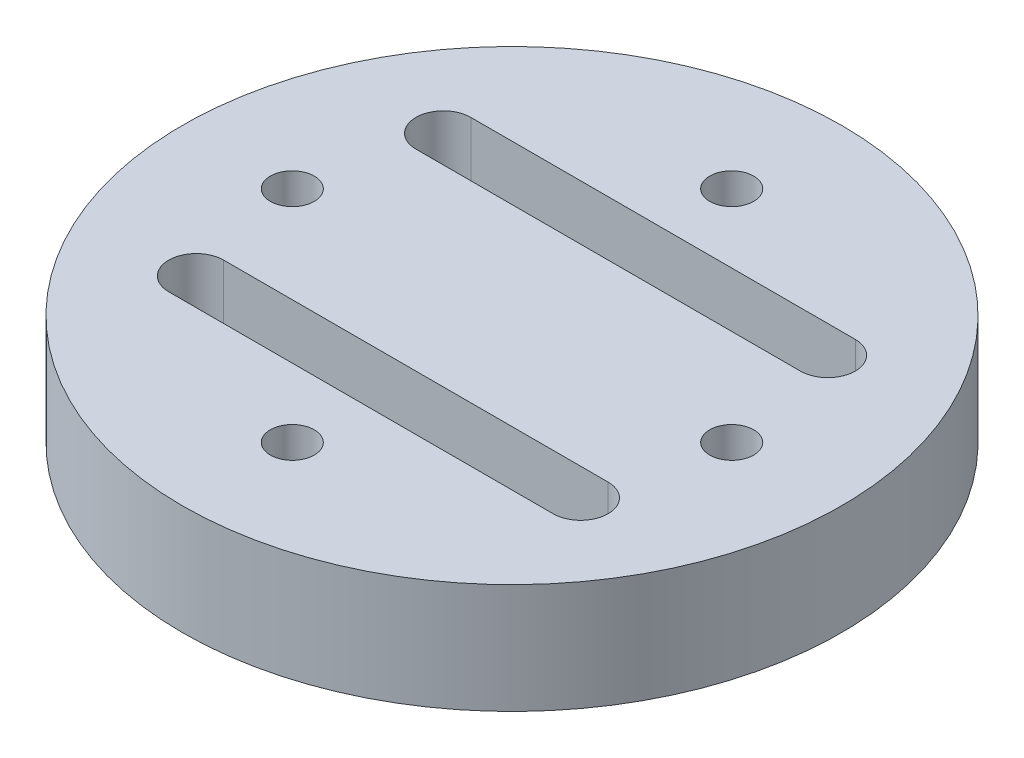
ISO-10303-21;
HEADER;
FILE_DESCRIPTION(('STEP AP214'),'2;1');
FILE_NAME('part.step','',(''),(''),'','','');
FILE_SCHEMA(('AUTOMOTIVE_DESIGN { 1 0 10303 214 1 1 1 1 }'));
ENDSEC;
DATA;
#1=APPLICATION_CONTEXT('core data for automotive mechanical design processes');
#2=APPLICATION_PROTOCOL_DEFINITION('international standard','automotive_design',2000,#1);
#3=PRODUCT_CONTEXT('',#1,'mechanical');
#4=PRODUCT('Part','Part','',(#3));
#5=PRODUCT_RELATED_PRODUCT_CATEGORY('part','',(#4));
#6=PRODUCT_DEFINITION_FORMATION('','',#4);
#7=PRODUCT_DEFINITION_CONTEXT('part definition',#1,'design');
#8=PRODUCT_DEFINITION('design','',#6,#7);
#9=PRODUCT_DEFINITION_SHAPE('','',#8);
#10=(LENGTH_UNIT() NAMED_UNIT(*) SI_UNIT(.MILLI.,.METRE.));
#11=(NAMED_UNIT(*) PLANE_ANGLE_UNIT() SI_UNIT($,.RADIAN.));
#12=(NAMED_UNIT(*) SI_UNIT($,.STERADIAN.) SOLID_ANGLE_UNIT());
#13=UNCERTAINTY_MEASURE_WITH_UNIT(LENGTH_MEASURE(1.E-05),#10,'distance_accuracy_value','');
#14=(GEOMETRIC_REPRESENTATION_CONTEXT(3) GLOBAL_UNCERTAINTY_ASSIGNED_CONTEXT((#13)) GLOBAL_UNIT_ASSIGNED_CONTEXT((#10,
#11,#12)) REPRESENTATION_CONTEXT('',''));
#15=CARTESIAN_POINT('',(0.,0.,0.));
#16=DIRECTION('',(0.,0.,1.));
#17=DIRECTION('',(1.,0.,0.));
#18=AXIS2_PLACEMENT_3D('',#15,#16,#17);
#19=CARTESIAN_POINT('',(0.,0.,0.));
#20=DIRECTION('',(0.,1.,0.));
#21=DIRECTION('',(0.,0.,1.));
#22=AXIS2_PLACEMENT_3D('',#19,#20,#21);
#23=PLANE('',#22);
#24=CARTESIAN_POINT('',(0.,0.,0.));
#25=DIRECTION('',(0.,1.,0.));
#26=DIRECTION('',(0.,0.,1.));
#27=AXIS2_PLACEMENT_3D('',#24,#25,#26);
#28=CIRCLE('',#27,60.);
#29=CARTESIAN_POINT('',(0.,0.,60.));
#30=VERTEX_POINT('',#29);
#31=EDGE_CURVE('E482',#30,#30,#28,.T.);
#32=ORIENTED_EDGE('',*,*,#31,.F.);
#33=EDGE_LOOP('',(#32));
#34=FACE_BOUND('',#33,.T.);
#35=CARTESIAN_POINT('',(-40.,0.,0.));
#36=DIRECTION('',(0.,1.,0.));
#37=DIRECTION('',(0.,0.,1.));
#38=AXIS2_PLACEMENT_3D('',#35,#36,#37);
#39=CIRCLE('',#38,4.00000000000001);
#40=CARTESIAN_POINT('',(-40.,0.,4.));
#41=VERTEX_POINT('',#40);
#42=EDGE_CURVE('E343',#41,#41,#39,.T.);
#43=ORIENTED_EDGE('',*,*,#42,.T.);
#44=EDGE_LOOP('',(#43));
#45=FACE_BOUND('',#44,.T.);
#46=CARTESIAN_POINT('',(0.,0.,40.));
#47=DIRECTION('',(0.,1.,0.));
#48=DIRECTION('',(0.,0.,1.));
#49=AXIS2_PLACEMENT_3D('',#46,#47,#48);
#50=CIRCLE('',#49,4.);
#51=CARTESIAN_POINT('',(0.,0.,44.));
#52=VERTEX_POINT('',#51);
#53=EDGE_CURVE('E365',#52,#52,#50,.T.);
#54=ORIENTED_EDGE('',*,*,#53,.T.);
#55=EDGE_LOOP('',(#54));
#56=FACE_BOUND('',#55,.T.);
#57=CARTESIAN_POINT('',(40.,0.,0.));
#58=DIRECTION('',(0.,1.,0.));
#59=DIRECTION('',(0.,0.,1.));
#60=AXIS2_PLACEMENT_3D('',#57,#58,#59);
#61=CIRCLE('',#60,4.00000000000001);
#62=CARTESIAN_POINT('',(40.,0.,4.));
#63=VERTEX_POINT('',#62);
#64=EDGE_CURVE('E357',#63,#63,#61,.T.);
#65=ORIENTED_EDGE('',*,*,#64,.T.);
#66=EDGE_LOOP('',(#65));
#67=FACE_BOUND('',#66,.T.);
#68=CARTESIAN_POINT('',(0.,0.,-40.));
#69=DIRECTION('',(0.,1.,0.));
#70=DIRECTION('',(0.,0.,1.));
#71=AXIS2_PLACEMENT_3D('',#68,#69,#70);
#72=CIRCLE('',#71,4.);
#73=CARTESIAN_POINT('',(0.,0.,-36.));
#74=VERTEX_POINT('',#73);
#75=EDGE_CURVE('E344',#74,#74,#72,.T.);
#76=ORIENTED_EDGE('',*,*,#75,.T.);
#77=EDGE_LOOP('',(#76));
#78=FACE_BOUND('',#77,.T.);
#79=DIRECTION('',(0.,0.,-1.));
#80=VECTOR('',#79,1.);
#81=CARTESIAN_POINT('',(11.5,0.,27.5));
#82=LINE('',#81,#80);
#83=CARTESIAN_POINT('',(11.5,0.,-27.5));
#84=VERTEX_POINT('',#83);
#85=CARTESIAN_POINT('',(11.5,0.,-29.5));
#86=VERTEX_POINT('',#85);
#87=EDGE_CURVE('E452',#84,#86,#82,.T.);
#88=ORIENTED_EDGE('',*,*,#87,.F.);
#89=DIRECTION('',(-1.,0.,0.));
#90=VECTOR('',#89,1.);
#91=CARTESIAN_POINT('',(-35.,0.,-27.5));
#92=LINE('',#91,#90);
#93=CARTESIAN_POINT('',(-11.5,0.,-27.5));
#94=VERTEX_POINT('',#93);
#95=EDGE_CURVE('E270',#84,#94,#92,.T.);
#96=ORIENTED_EDGE('',*,*,#95,.T.);
#97=DIRECTION('',(0.,0.,-1.));
#98=VECTOR('',#97,1.);
#99=CARTESIAN_POINT('',(-11.5,0.,27.5));
#100=LINE('',#99,#98);
#101=CARTESIAN_POINT('',(-11.5,0.,-29.5));
#102=VERTEX_POINT('',#101);
#103=EDGE_CURVE('E472',#102,#94,#100,.F.);
#104=ORIENTED_EDGE('',*,*,#103,.F.);
#105=DIRECTION('',(1.,0.,0.));
#106=VECTOR('',#105,1.);
#107=CARTESIAN_POINT('',(0.,0.,-29.5));
#108=LINE('',#107,#106);
#109=CARTESIAN_POINT('',(-23.5,0.,-29.5));
#110=VERTEX_POINT('',#109);
#111=EDGE_CURVE('E503',#110,#102,#108,.T.);
#112=ORIENTED_EDGE('',*,*,#111,.F.);
#113=DIRECTION('',(0.,0.,-1.));
#114=VECTOR('',#113,1.);
#115=CARTESIAN_POINT('',(-23.5,0.,27.5));
#116=LINE('',#115,#114);
#117=CARTESIAN_POINT('',(-23.5,0.,-27.5));
#118=VERTEX_POINT('',#117);
#119=EDGE_CURVE('E462',#118,#110,#116,.T.);
#120=ORIENTED_EDGE('',*,*,#119,.F.);
#121=CARTESIAN_POINT('',(-35.,0.,-27.5));
#122=VERTEX_POINT('',#121);
#123=EDGE_CURVE('E253',#118,#122,#92,.T.);
#124=ORIENTED_EDGE('',*,*,#123,.T.);
#125=CARTESIAN_POINT('',(-35.,0.,-22.5));
#126=DIRECTION('',(0.,1.,0.));
#127=DIRECTION('',(0.,0.,1.));
#128=AXIS2_PLACEMENT_3D('',#125,#126,#127);
#129=CIRCLE('',#128,5.);
#130=CARTESIAN_POINT('',(-35.,0.,-17.5));
#131=VERTEX_POINT('',#130);
#132=EDGE_CURVE('E232',#122,#131,#129,.T.);
#133=ORIENTED_EDGE('',*,*,#132,.T.);
#134=DIRECTION('',(1.,0.,0.));
#135=VECTOR('',#134,1.);
#136=CARTESIAN_POINT('',(-35.,0.,-17.5));
#137=LINE('',#136,#135);
#138=CARTESIAN_POINT('',(-23.5,0.,-17.5));
#139=VERTEX_POINT('',#138);
#140=EDGE_CURVE('E241',#131,#139,#137,.T.);
#141=ORIENTED_EDGE('',*,*,#140,.T.);
#142=CARTESIAN_POINT('',(-23.5,0.,-16.25));
#143=VERTEX_POINT('',#142);
#144=EDGE_CURVE('E465',#143,#139,#116,.T.);
#145=ORIENTED_EDGE('',*,*,#144,.F.);
#146=DIRECTION('',(1.,0.,0.));
#147=VECTOR('',#146,1.);
#148=CARTESIAN_POINT('',(0.,0.,-16.25));
#149=LINE('',#148,#147);
#150=CARTESIAN_POINT('',(-33.5,0.,-16.25));
#151=VERTEX_POINT('',#150);
#152=EDGE_CURVE('E394',#151,#143,#149,.T.);
#153=ORIENTED_EDGE('',*,*,#152,.F.);
#154=DIRECTION('',(0.,0.,1.));
#155=VECTOR('',#154,1.);
#156=CARTESIAN_POINT('',(-33.5,0.,-16.25));
#157=LINE('',#156,#155);
#158=CARTESIAN_POINT('',(-33.5,0.,16.25));
#159=VERTEX_POINT('',#158);
#160=EDGE_CURVE('E439',#151,#159,#157,.T.);
#161=ORIENTED_EDGE('',*,*,#160,.T.);
#162=DIRECTION('',(1.,0.,0.));
#163=VECTOR('',#162,1.);
#164=CARTESIAN_POINT('',(0.,0.,16.25));
#165=LINE('',#164,#163);
#166=CARTESIAN_POINT('',(-23.5,0.,16.25));
#167=VERTEX_POINT('',#166);
#168=EDGE_CURVE('E403',#159,#167,#165,.T.);
#169=ORIENTED_EDGE('',*,*,#168,.T.);
#170=CARTESIAN_POINT('',(-23.5,0.,17.5));
#171=VERTEX_POINT('',#170);
#172=EDGE_CURVE('E467',#171,#167,#116,.T.);
#173=ORIENTED_EDGE('',*,*,#172,.F.);
#174=DIRECTION('',(-1.,0.,0.));
#175=VECTOR('',#174,1.);
#176=CARTESIAN_POINT('',(-35.,0.,17.5));
#177=LINE('',#176,#175);
#178=CARTESIAN_POINT('',(-35.,0.,17.5));
#179=VERTEX_POINT('',#178);
#180=EDGE_CURVE('E293',#171,#179,#177,.T.);
#181=ORIENTED_EDGE('',*,*,#180,.T.);
#182=CARTESIAN_POINT('',(-35.,0.,22.5));
#183=DIRECTION('',(0.,1.,0.));
#184=DIRECTION('',(0.,0.,-1.));
#185=AXIS2_PLACEMENT_3D('',#182,#183,#184);
#186=CIRCLE('',#185,5.);
#187=CARTESIAN_POINT('',(-35.,0.,27.5));
#188=VERTEX_POINT('',#187);
#189=EDGE_CURVE('E308',#179,#188,#186,.T.);
#190=ORIENTED_EDGE('',*,*,#189,.T.);
#191=DIRECTION('',(1.,0.,0.));
#192=VECTOR('',#191,1.);
#193=CARTESIAN_POINT('',(0.,0.,27.5));
#194=LINE('',#193,#192);
#195=CARTESIAN_POINT('',(35.,0.,27.5));
#196=VERTEX_POINT('',#195);
#197=EDGE_CURVE('E500',#188,#196,#194,.T.);
#198=ORIENTED_EDGE('',*,*,#197,.T.);
#199=CARTESIAN_POINT('',(35.,0.,22.5));
#200=DIRECTION('',(0.,1.,0.));
#201=DIRECTION('',(0.,0.,-1.));
#202=AXIS2_PLACEMENT_3D('',#199,#200,#201);
#203=CIRCLE('',#202,5.);
#204=CARTESIAN_POINT('',(35.,0.,17.5));
#205=VERTEX_POINT('',#204);
#206=EDGE_CURVE('E322',#196,#205,#203,.T.);
#207=ORIENTED_EDGE('',*,*,#206,.T.);
#208=CARTESIAN_POINT('',(23.5,0.,17.5));
#209=VERTEX_POINT('',#208);
#210=EDGE_CURVE('E318',#205,#209,#177,.T.);
#211=ORIENTED_EDGE('',*,*,#210,.T.);
#212=DIRECTION('',(0.,0.,-1.));
#213=VECTOR('',#212,1.);
#214=CARTESIAN_POINT('',(23.5,0.,27.5));
#215=LINE('',#214,#213);
#216=CARTESIAN_POINT('',(23.5,0.,16.25));
#217=VERTEX_POINT('',#216);
#218=EDGE_CURVE('E456',#217,#209,#215,.F.);
#219=ORIENTED_EDGE('',*,*,#218,.F.);
#220=DIRECTION('',(1.,0.,0.));
#221=VECTOR('',#220,1.);
#222=CARTESIAN_POINT('',(0.,0.,16.25));
#223=LINE('',#222,#221);
#224=CARTESIAN_POINT('',(33.5,0.,16.25));
#225=VERTEX_POINT('',#224);
#226=EDGE_CURVE('E404',#217,#225,#223,.T.);
#227=ORIENTED_EDGE('',*,*,#226,.T.);
#228=DIRECTION('',(0.,0.,1.));
#229=VECTOR('',#228,1.);
#230=CARTESIAN_POINT('',(33.5,0.,-16.25));
#231=LINE('',#230,#229);
#232=CARTESIAN_POINT('',(33.5,0.,-16.25));
#233=VERTEX_POINT('',#232);
#234=EDGE_CURVE('E422',#225,#233,#231,.F.);
#235=ORIENTED_EDGE('',*,*,#234,.T.);
#236=DIRECTION('',(1.,0.,0.));
#237=VECTOR('',#236,1.);
#238=CARTESIAN_POINT('',(0.,0.,-16.25));
#239=LINE('',#238,#237);
#240=CARTESIAN_POINT('',(23.5,0.,-16.25));
#241=VERTEX_POINT('',#240);
#242=EDGE_CURVE('E395',#241,#233,#239,.T.);
#243=ORIENTED_EDGE('',*,*,#242,.F.);
#244=CARTESIAN_POINT('',(23.5,0.,-17.5));
#245=VERTEX_POINT('',#244);
#246=EDGE_CURVE('E460',#245,#241,#215,.F.);
#247=ORIENTED_EDGE('',*,*,#246,.F.);
#248=CARTESIAN_POINT('',(35.,0.,-17.5));
#249=VERTEX_POINT('',#248);
#250=EDGE_CURVE('E250',#245,#249,#137,.T.);
#251=ORIENTED_EDGE('',*,*,#250,.T.);
#252=CARTESIAN_POINT('',(35.,0.,-22.5));
#253=DIRECTION('',(0.,1.,0.));
#254=DIRECTION('',(0.,0.,1.));
#255=AXIS2_PLACEMENT_3D('',#252,#253,#254);
#256=CIRCLE('',#255,5.);
#257=CARTESIAN_POINT('',(35.,0.,-27.5));
#258=VERTEX_POINT('',#257);
#259=EDGE_CURVE('E248',#249,#258,#256,.T.);
#260=ORIENTED_EDGE('',*,*,#259,.T.);
#261=CARTESIAN_POINT('',(23.5,0.,-27.5));
#262=VERTEX_POINT('',#261);
#263=EDGE_CURVE('E238',#258,#262,#92,.T.);
#264=ORIENTED_EDGE('',*,*,#263,.T.);
#265=CARTESIAN_POINT('',(23.5,0.,-29.5));
#266=VERTEX_POINT('',#265);
#267=EDGE_CURVE('E461',#266,#262,#215,.F.);
#268=ORIENTED_EDGE('',*,*,#267,.F.);
#269=DIRECTION('',(1.,0.,0.));
#270=VECTOR('',#269,1.);
#271=CARTESIAN_POINT('',(0.,0.,-29.5));
#272=LINE('',#271,#270);
#273=EDGE_CURVE('E494',#86,#266,#272,.T.);
#274=ORIENTED_EDGE('',*,*,#273,.F.);
#275=EDGE_LOOP('',(#88,#96,#104,#112,#120,#124,#133,#141,#145,#153,#161,#169,#173,#181,#190,
#198,#207,#211,#219,#227,#235,#243,#247,#251,#260,#264,#268,#274));
#276=FACE_BOUND('',#275,.T.);
#277=ADVANCED_FACE('F45',(#34,#45,#56,#67,#78,#276),#23,.F.);
#278=CARTESIAN_POINT('',(11.5,0.,17.5));
#279=VERTEX_POINT('',#278);
#280=CARTESIAN_POINT('',(11.5,0.,16.25));
#281=VERTEX_POINT('',#280);
#282=EDGE_CURVE('E448',#279,#281,#82,.T.);
#283=ORIENTED_EDGE('',*,*,#282,.F.);
#284=CARTESIAN_POINT('',(-11.5,0.,17.5));
#285=VERTEX_POINT('',#284);
#286=EDGE_CURVE('E323',#279,#285,#177,.T.);
#287=ORIENTED_EDGE('',*,*,#286,.T.);
#288=CARTESIAN_POINT('',(-11.5,0.,16.25));
#289=VERTEX_POINT('',#288);
#290=EDGE_CURVE('E466',#289,#285,#100,.F.);
#291=ORIENTED_EDGE('',*,*,#290,.F.);
#292=CARTESIAN_POINT('',(-1.5,0.,16.25));
#293=VERTEX_POINT('',#292);
#294=EDGE_CURVE('E399',#289,#293,#165,.T.);
#295=ORIENTED_EDGE('',*,*,#294,.T.);
#296=DIRECTION('',(0.,0.,1.));
#297=VECTOR('',#296,1.);
#298=CARTESIAN_POINT('',(-1.5,0.,-16.25));
#299=LINE('',#298,#297);
#300=CARTESIAN_POINT('',(-1.5,0.,12.5));
#301=VERTEX_POINT('',#300);
#302=EDGE_CURVE('E438',#293,#301,#299,.F.);
#303=ORIENTED_EDGE('',*,*,#302,.T.);
#304=DIRECTION('',(-1.,0.,0.));
#305=VECTOR('',#304,1.);
#306=CARTESIAN_POINT('',(-30.,0.,12.5));
#307=LINE('',#306,#305);
#308=CARTESIAN_POINT('',(1.5,0.,12.5));
#309=VERTEX_POINT('',#308);
#310=EDGE_CURVE('E483',#309,#301,#307,.T.);
#311=ORIENTED_EDGE('',*,*,#310,.F.);
#312=DIRECTION('',(0.,0.,1.));
#313=VECTOR('',#312,1.);
#314=CARTESIAN_POINT('',(1.5,0.,-16.25));
#315=LINE('',#314,#313);
#316=CARTESIAN_POINT('',(1.5,0.,16.25));
#317=VERTEX_POINT('',#316);
#318=EDGE_CURVE('E417',#309,#317,#315,.T.);
#319=ORIENTED_EDGE('',*,*,#318,.T.);
#320=EDGE_CURVE('E408',#317,#281,#223,.T.);
#321=ORIENTED_EDGE('',*,*,#320,.T.);
#322=EDGE_LOOP('',(#283,#287,#291,#295,#303,#311,#319,#321));
#323=FACE_BOUND('',#322,.T.);
#324=ADVANCED_FACE('F582',(#323),#23,.F.);
#325=CARTESIAN_POINT('',(17.5,0.,27.5));
#326=DIRECTION('',(0.,0.,-1.));
#327=DIRECTION('',(-1.,0.,0.));
#328=AXIS2_PLACEMENT_3D('',#325,#326,#327);
#329=CYLINDRICAL_SURFACE('',#328,6.);
#330=CARTESIAN_POINT('',(17.5,0.,-27.5));
#331=DIRECTION('',(0.,0.,-1.));
#332=DIRECTION('',(-1.,0.,0.));
#333=AXIS2_PLACEMENT_3D('',#330,#331,#332);
#334=CIRCLE('',#333,6.);
#335=EDGE_CURVE('E340',#84,#262,#334,.T.);
#336=ORIENTED_EDGE('',*,*,#335,.F.);
#337=ORIENTED_EDGE('',*,*,#87,.T.);
#338=CARTESIAN_POINT('',(17.5,0.,-29.5));
#339=DIRECTION('',(0.,0.,1.));
#340=DIRECTION('',(1.,0.,0.));
#341=AXIS2_PLACEMENT_3D('',#338,#339,#340);
#342=CIRCLE('',#341,6.);
#343=EDGE_CURVE('E443',#266,#86,#342,.T.);
#344=ORIENTED_EDGE('',*,*,#343,.F.);
#345=ORIENTED_EDGE('',*,*,#267,.T.);
#346=EDGE_LOOP('',(#336,#337,#344,#345));
#347=FACE_BOUND('',#346,.T.);
#348=ADVANCED_FACE('F618',(#347),#329,.F.);
#349=CARTESIAN_POINT('',(-17.5,0.,27.5));
#350=DIRECTION('',(0.,0.,-1.));
#351=DIRECTION('',(-1.,0.,0.));
#352=AXIS2_PLACEMENT_3D('',#349,#350,#351);
#353=CYLINDRICAL_SURFACE('',#352,6.);
#354=CARTESIAN_POINT('',(-17.5,0.,-27.5));
#355=DIRECTION('',(0.,0.,-1.));
#356=DIRECTION('',(-1.,0.,0.));
#357=AXIS2_PLACEMENT_3D('',#354,#355,#356);
#358=CIRCLE('',#357,6.);
#359=EDGE_CURVE('E337',#118,#94,#358,.T.);
#360=ORIENTED_EDGE('',*,*,#359,.F.);
#361=ORIENTED_EDGE('',*,*,#119,.T.);
#362=CARTESIAN_POINT('',(-17.5,0.,-29.5));
#363=DIRECTION('',(0.,0.,1.));
#364=DIRECTION('',(1.,0.,0.));
#365=AXIS2_PLACEMENT_3D('',#362,#363,#364);
#366=CIRCLE('',#365,6.);
#367=EDGE_CURVE('E444',#102,#110,#366,.T.);
#368=ORIENTED_EDGE('',*,*,#367,.F.);
#369=ORIENTED_EDGE('',*,*,#103,.T.);
#370=EDGE_LOOP('',(#360,#361,#368,#369));
#371=FACE_BOUND('',#370,.T.);
#372=ADVANCED_FACE('F629',(#371),#353,.F.);
#373=CARTESIAN_POINT('',(-11.5,0.,-17.5));
#374=VERTEX_POINT('',#373);
#375=CARTESIAN_POINT('',(-11.5,0.,-16.25));
#376=VERTEX_POINT('',#375);
#377=EDGE_CURVE('E471',#374,#376,#100,.F.);
#378=ORIENTED_EDGE('',*,*,#377,.F.);
#379=CARTESIAN_POINT('',(11.5,0.,-17.5));
#380=VERTEX_POINT('',#379);
#381=EDGE_CURVE('E61',#374,#380,#137,.T.);
#382=ORIENTED_EDGE('',*,*,#381,.T.);
#383=CARTESIAN_POINT('',(11.5,0.,-16.25));
#384=VERTEX_POINT('',#383);
#385=EDGE_CURVE('E455',#384,#380,#82,.T.);
#386=ORIENTED_EDGE('',*,*,#385,.F.);
#387=CARTESIAN_POINT('',(1.5,0.,-16.25));
#388=VERTEX_POINT('',#387);
#389=EDGE_CURVE('E398',#388,#384,#239,.T.);
#390=ORIENTED_EDGE('',*,*,#389,.F.);
#391=CARTESIAN_POINT('',(1.5,0.,-12.5));
#392=VERTEX_POINT('',#391);
#393=EDGE_CURVE('E421',#388,#392,#315,.T.);
#394=ORIENTED_EDGE('',*,*,#393,.T.);
#395=DIRECTION('',(1.,0.,0.));
#396=VECTOR('',#395,1.);
#397=CARTESIAN_POINT('',(-30.,0.,-12.5));
#398=LINE('',#397,#396);
#399=CARTESIAN_POINT('',(-1.5,0.,-12.5));
#400=VERTEX_POINT('',#399);
#401=EDGE_CURVE('E478',#400,#392,#398,.T.);
#402=ORIENTED_EDGE('',*,*,#401,.F.);
#403=CARTESIAN_POINT('',(-1.5,0.,-16.25));
#404=VERTEX_POINT('',#403);
#405=EDGE_CURVE('E434',#400,#404,#299,.F.);
#406=ORIENTED_EDGE('',*,*,#405,.T.);
#407=EDGE_CURVE('E380',#376,#404,#149,.T.);
#408=ORIENTED_EDGE('',*,*,#407,.F.);
#409=EDGE_LOOP('',(#378,#382,#386,#390,#394,#402,#406,#408));
#410=FACE_BOUND('',#409,.T.);
#411=ADVANCED_FACE('F546',(#410),#23,.F.);
#412=CARTESIAN_POINT('',(17.5,0.,-17.5));
#413=DIRECTION('',(0.,0.,1.));
#414=DIRECTION('',(1.,0.,0.));
#415=AXIS2_PLACEMENT_3D('',#412,#413,#414);
#416=CIRCLE('',#415,6.);
#417=EDGE_CURVE('E334',#245,#380,#416,.T.);
#418=ORIENTED_EDGE('',*,*,#417,.F.);
#419=ORIENTED_EDGE('',*,*,#246,.T.);
#420=CARTESIAN_POINT('',(17.5,0.,-16.25));
#421=DIRECTION('',(0.,0.,1.));
#422=DIRECTION('',(1.,0.,0.));
#423=AXIS2_PLACEMENT_3D('',#420,#421,#422);
#424=CIRCLE('',#423,6.);
#425=EDGE_CURVE('E510',#241,#384,#424,.T.);
#426=ORIENTED_EDGE('',*,*,#425,.T.);
#427=ORIENTED_EDGE('',*,*,#385,.T.);
#428=EDGE_LOOP('',(#418,#419,#426,#427));
#429=FACE_BOUND('',#428,.T.);
#430=ADVANCED_FACE('F565',(#429),#329,.F.);
#431=CARTESIAN_POINT('',(-17.5,0.,-17.5));
#432=DIRECTION('',(0.,0.,1.));
#433=DIRECTION('',(1.,0.,0.));
#434=AXIS2_PLACEMENT_3D('',#431,#432,#433);
#435=CIRCLE('',#434,6.);
#436=EDGE_CURVE('E243',#374,#139,#435,.T.);
#437=ORIENTED_EDGE('',*,*,#436,.F.);
#438=ORIENTED_EDGE('',*,*,#377,.T.);
#439=CARTESIAN_POINT('',(-17.5,0.,-16.25));
#440=DIRECTION('',(0.,0.,1.));
#441=DIRECTION('',(1.,0.,0.));
#442=AXIS2_PLACEMENT_3D('',#439,#440,#441);
#443=CIRCLE('',#442,6.);
#444=EDGE_CURVE('E506',#376,#143,#443,.T.);
#445=ORIENTED_EDGE('',*,*,#444,.T.);
#446=ORIENTED_EDGE('',*,*,#144,.T.);
#447=EDGE_LOOP('',(#437,#438,#445,#446));
#448=FACE_BOUND('',#447,.T.);
#449=ADVANCED_FACE('F606',(#448),#353,.F.);
#450=CARTESIAN_POINT('',(0.,20.,0.));
#451=DIRECTION('',(0.,-1.,0.));
#452=DIRECTION('',(0.,0.,-1.));
#453=AXIS2_PLACEMENT_3D('',#450,#451,#452);
#454=CYLINDRICAL_SURFACE('',#453,60.);
#455=CARTESIAN_POINT('',(0.,20.,0.));
#456=DIRECTION('',(0.,1.,0.));
#457=DIRECTION('',(0.,0.,1.));
#458=AXIS2_PLACEMENT_3D('',#455,#456,#457);
#459=CIRCLE('',#458,60.);
#460=CARTESIAN_POINT('',(0.,20.,60.));
#461=VERTEX_POINT('',#460);
#462=EDGE_CURVE('E490',#461,#461,#459,.T.);
#463=ORIENTED_EDGE('',*,*,#462,.F.);
#464=EDGE_LOOP('',(#463));
#465=FACE_BOUND('',#464,.T.);
#466=ORIENTED_EDGE('',*,*,#31,.T.);
#467=EDGE_LOOP('',(#466));
#468=FACE_BOUND('',#467,.T.);
#469=ADVANCED_FACE('F47',(#465,#468),#454,.T.);
#470=CARTESIAN_POINT('',(0.,20.,0.));
#471=DIRECTION('',(0.,1.,0.));
#472=DIRECTION('',(0.,0.,1.));
#473=AXIS2_PLACEMENT_3D('',#470,#471,#472);
#474=PLANE('',#473);
#475=CARTESIAN_POINT('',(-35.,20.,-22.5));
#476=DIRECTION('',(0.,1.,0.));
#477=DIRECTION('',(0.,0.,1.));
#478=AXIS2_PLACEMENT_3D('',#475,#476,#477);
#479=CIRCLE('',#478,5.);
#480=CARTESIAN_POINT('',(-35.,20.,-27.5));
#481=VERTEX_POINT('',#480);
#482=CARTESIAN_POINT('',(-35.,20.,-17.5));
#483=VERTEX_POINT('',#482);
#484=EDGE_CURVE('E69',#481,#483,#479,.T.);
#485=ORIENTED_EDGE('',*,*,#484,.F.);
#486=DIRECTION('',(-1.,0.,0.));
#487=VECTOR('',#486,1.);
#488=CARTESIAN_POINT('',(-35.,20.,-27.5));
#489=LINE('',#488,#487);
#490=CARTESIAN_POINT('',(35.,20.,-27.5));
#491=VERTEX_POINT('',#490);
#492=EDGE_CURVE('E255',#491,#481,#489,.T.);
#493=ORIENTED_EDGE('',*,*,#492,.F.);
#494=CARTESIAN_POINT('',(35.,20.,-22.5));
#495=DIRECTION('',(0.,1.,0.));
#496=DIRECTION('',(0.,0.,1.));
#497=AXIS2_PLACEMENT_3D('',#494,#495,#496);
#498=CIRCLE('',#497,5.);
#499=CARTESIAN_POINT('',(35.,20.,-17.5));
#500=VERTEX_POINT('',#499);
#501=EDGE_CURVE('E261',#500,#491,#498,.T.);
#502=ORIENTED_EDGE('',*,*,#501,.F.);
#503=DIRECTION('',(1.,0.,0.));
#504=VECTOR('',#503,1.);
#505=CARTESIAN_POINT('',(-35.,20.,-17.5));
#506=LINE('',#505,#504);
#507=EDGE_CURVE('E273',#483,#500,#506,.T.);
#508=ORIENTED_EDGE('',*,*,#507,.F.);
#509=EDGE_LOOP('',(#485,#493,#502,#508));
#510=FACE_BOUND('',#509,.T.);
#511=CARTESIAN_POINT('',(-35.,20.,22.5));
#512=DIRECTION('',(0.,1.,0.));
#513=DIRECTION('',(0.,0.,-1.));
#514=AXIS2_PLACEMENT_3D('',#511,#512,#513);
#515=CIRCLE('',#514,5.);
#516=CARTESIAN_POINT('',(-35.,20.,17.5));
#517=VERTEX_POINT('',#516);
#518=CARTESIAN_POINT('',(-35.,20.,27.5));
#519=VERTEX_POINT('',#518);
#520=EDGE_CURVE('E274',#517,#519,#515,.T.);
#521=ORIENTED_EDGE('',*,*,#520,.F.);
#522=DIRECTION('',(-1.,0.,0.));
#523=VECTOR('',#522,1.);
#524=CARTESIAN_POINT('',(-35.,20.,17.5));
#525=LINE('',#524,#523);
#526=CARTESIAN_POINT('',(35.,20.,17.5));
#527=VERTEX_POINT('',#526);
#528=EDGE_CURVE('E303',#527,#517,#525,.T.);
#529=ORIENTED_EDGE('',*,*,#528,.F.);
#530=CARTESIAN_POINT('',(35.,20.,22.5));
#531=DIRECTION('',(0.,1.,0.));
#532=DIRECTION('',(0.,0.,-1.));
#533=AXIS2_PLACEMENT_3D('',#530,#531,#532);
#534=CIRCLE('',#533,5.);
#535=CARTESIAN_POINT('',(35.,20.,27.5));
#536=VERTEX_POINT('',#535);
#537=EDGE_CURVE('E307',#536,#527,#534,.T.);
#538=ORIENTED_EDGE('',*,*,#537,.F.);
#539=DIRECTION('',(1.,0.,0.));
#540=VECTOR('',#539,1.);
#541=CARTESIAN_POINT('',(-35.,20.,27.5));
#542=LINE('',#541,#540);
#543=EDGE_CURVE('E312',#519,#536,#542,.T.);
#544=ORIENTED_EDGE('',*,*,#543,.F.);
#545=EDGE_LOOP('',(#521,#529,#538,#544));
#546=FACE_BOUND('',#545,.T.);
#547=CARTESIAN_POINT('',(0.,20.,-40.));
#548=DIRECTION('',(0.,1.,0.));
#549=DIRECTION('',(0.,0.,1.));
#550=AXIS2_PLACEMENT_3D('',#547,#548,#549);
#551=CIRCLE('',#550,4.);
#552=CARTESIAN_POINT('',(0.,20.,-36.));
#553=VERTEX_POINT('',#552);
#554=EDGE_CURVE('E349',#553,#553,#551,.T.);
#555=ORIENTED_EDGE('',*,*,#554,.F.);
#556=EDGE_LOOP('',(#555));
#557=FACE_BOUND('',#556,.T.);
#558=CARTESIAN_POINT('',(40.,20.,0.));
#559=DIRECTION('',(0.,1.,0.));
#560=DIRECTION('',(0.,0.,1.));
#561=AXIS2_PLACEMENT_3D('',#558,#559,#560);
#562=CIRCLE('',#561,4.00000000000001);
#563=CARTESIAN_POINT('',(40.,20.,4.));
#564=VERTEX_POINT('',#563);
#565=EDGE_CURVE('E353',#564,#564,#562,.T.);
#566=ORIENTED_EDGE('',*,*,#565,.F.);
#567=EDGE_LOOP('',(#566));
#568=FACE_BOUND('',#567,.T.);
#569=CARTESIAN_POINT('',(0.,20.,40.));
#570=DIRECTION('',(0.,1.,0.));
#571=DIRECTION('',(0.,0.,1.));
#572=AXIS2_PLACEMENT_3D('',#569,#570,#571);
#573=CIRCLE('',#572,4.);
#574=CARTESIAN_POINT('',(0.,20.,44.));
#575=VERTEX_POINT('',#574);
#576=EDGE_CURVE('E361',#575,#575,#573,.T.);
#577=ORIENTED_EDGE('',*,*,#576,.F.);
#578=EDGE_LOOP('',(#577));
#579=FACE_BOUND('',#578,.T.);
#580=CARTESIAN_POINT('',(-40.,20.,0.));
#581=DIRECTION('',(0.,1.,0.));
#582=DIRECTION('',(0.,0.,1.));
#583=AXIS2_PLACEMENT_3D('',#580,#581,#582);
#584=CIRCLE('',#583,4.00000000000001);
#585=CARTESIAN_POINT('',(-40.,20.,4.));
#586=VERTEX_POINT('',#585);
#587=EDGE_CURVE('E369',#586,#586,#584,.T.);
#588=ORIENTED_EDGE('',*,*,#587,.F.);
#589=EDGE_LOOP('',(#588));
#590=FACE_BOUND('',#589,.T.);
#591=ORIENTED_EDGE('',*,*,#462,.T.);
#592=EDGE_LOOP('',(#591));
#593=FACE_BOUND('',#592,.T.);
#594=ADVANCED_FACE('F671',(#510,#546,#557,#568,#579,#590,#593),#474,.T.);
#595=CARTESIAN_POINT('',(-30.,8.,-12.5));
#596=DIRECTION('',(0.,0.,-1.));
#597=DIRECTION('',(-1.,0.,0.));
#598=AXIS2_PLACEMENT_3D('',#595,#596,#597);
#599=PLANE('',#598);
#600=DIRECTION('',(1.,0.,0.));
#601=VECTOR('',#600,1.);
#602=CARTESIAN_POINT('',(-30.,8.,-12.5));
#603=LINE('',#602,#601);
#604=CARTESIAN_POINT('',(-3.64359353944898,8.,-12.5));
#605=VERTEX_POINT('',#604);
#606=CARTESIAN_POINT('',(3.64359353944898,8.,-12.5));
#607=VERTEX_POINT('',#606);
#608=EDGE_CURVE('E477',#605,#607,#603,.T.);
#609=ORIENTED_EDGE('',*,*,#608,.F.);
#610=CARTESIAN_POINT('',(-17.5,0.,-12.5));
#611=DIRECTION('',(0.,0.,-1.));
#612=DIRECTION('',(-1.,0.,0.));
#613=AXIS2_PLACEMENT_3D('',#610,#611,#612);
#614=CIRCLE('',#613,16.);
#615=EDGE_CURVE('E430',#605,#400,#614,.T.);
#616=ORIENTED_EDGE('',*,*,#615,.T.);
#617=ORIENTED_EDGE('',*,*,#401,.T.);
#618=CARTESIAN_POINT('',(17.5,0.,-12.5));
#619=DIRECTION('',(0.,0.,-1.));
#620=DIRECTION('',(-1.,0.,0.));
#621=AXIS2_PLACEMENT_3D('',#618,#619,#620);
#622=CIRCLE('',#621,16.);
#623=EDGE_CURVE('E413',#392,#607,#622,.T.);
#624=ORIENTED_EDGE('',*,*,#623,.T.);
#625=EDGE_LOOP('',(#609,#616,#617,#624));
#626=FACE_BOUND('',#625,.T.);
#627=ADVANCED_FACE('F542',(#626),#599,.F.);
#628=CARTESIAN_POINT('',(-30.,8.,12.5));
#629=DIRECTION('',(0.,0.,1.));
#630=DIRECTION('',(1.,0.,0.));
#631=AXIS2_PLACEMENT_3D('',#628,#629,#630);
#632=PLANE('',#631);
#633=ORIENTED_EDGE('',*,*,#310,.T.);
#634=CARTESIAN_POINT('',(-17.5,0.,12.5));
#635=DIRECTION('',(0.,0.,1.));
#636=DIRECTION('',(1.,0.,0.));
#637=AXIS2_PLACEMENT_3D('',#634,#635,#636);
#638=CIRCLE('',#637,16.);
#639=CARTESIAN_POINT('',(-3.64359353944898,8.,12.5));
#640=VERTEX_POINT('',#639);
#641=EDGE_CURVE('E426',#301,#640,#638,.T.);
#642=ORIENTED_EDGE('',*,*,#641,.T.);
#643=DIRECTION('',(-1.,0.,0.));
#644=VECTOR('',#643,1.);
#645=CARTESIAN_POINT('',(-30.,8.,12.5));
#646=LINE('',#645,#644);
#647=CARTESIAN_POINT('',(3.64359353944898,8.,12.5));
#648=VERTEX_POINT('',#647);
#649=EDGE_CURVE('E473',#648,#640,#646,.T.);
#650=ORIENTED_EDGE('',*,*,#649,.F.);
#651=CARTESIAN_POINT('',(17.5,0.,12.5));
#652=DIRECTION('',(0.,0.,1.));
#653=DIRECTION('',(1.,0.,0.));
#654=AXIS2_PLACEMENT_3D('',#651,#652,#653);
#655=CIRCLE('',#654,16.);
#656=EDGE_CURVE('E409',#648,#309,#655,.T.);
#657=ORIENTED_EDGE('',*,*,#656,.T.);
#658=EDGE_LOOP('',(#633,#642,#650,#657));
#659=FACE_BOUND('',#658,.T.);
#660=ADVANCED_FACE('F534',(#659),#632,.F.);
#661=CARTESIAN_POINT('',(0.,8.,0.));
#662=DIRECTION('',(0.,-1.,0.));
#663=DIRECTION('',(0.,0.,-1.));
#664=AXIS2_PLACEMENT_3D('',#661,#662,#663);
#665=PLANE('',#664);
#666=DIRECTION('',(0.,0.,1.));
#667=VECTOR('',#666,1.);
#668=CARTESIAN_POINT('',(-3.64359353944898,8.,-16.25));
#669=LINE('',#668,#667);
#670=EDGE_CURVE('E54',#605,#640,#669,.T.);
#671=ORIENTED_EDGE('',*,*,#670,.F.);
#672=ORIENTED_EDGE('',*,*,#608,.T.);
#673=DIRECTION('',(0.,0.,1.));
#674=VECTOR('',#673,1.);
#675=CARTESIAN_POINT('',(3.64359353944898,8.,-16.25));
#676=LINE('',#675,#674);
#677=EDGE_CURVE('E522',#648,#607,#676,.F.);
#678=ORIENTED_EDGE('',*,*,#677,.F.);
#679=ORIENTED_EDGE('',*,*,#649,.T.);
#680=EDGE_LOOP('',(#671,#672,#678,#679));
#681=FACE_BOUND('',#680,.T.);
#682=ADVANCED_FACE('F537',(#681),#665,.T.);
#683=CARTESIAN_POINT('',(17.5,0.,17.5));
#684=DIRECTION('',(0.,0.,-1.));
#685=DIRECTION('',(-1.,0.,0.));
#686=AXIS2_PLACEMENT_3D('',#683,#684,#685);
#687=CIRCLE('',#686,6.);
#688=EDGE_CURVE('E283',#279,#209,#687,.T.);
#689=ORIENTED_EDGE('',*,*,#688,.F.);
#690=ORIENTED_EDGE('',*,*,#282,.T.);
#691=CARTESIAN_POINT('',(17.5,0.,16.25));
#692=DIRECTION('',(0.,0.,1.));
#693=DIRECTION('',(1.,0.,0.));
#694=AXIS2_PLACEMENT_3D('',#691,#692,#693);
#695=CIRCLE('',#694,6.);
#696=EDGE_CURVE('E518',#217,#281,#695,.T.);
#697=ORIENTED_EDGE('',*,*,#696,.F.);
#698=ORIENTED_EDGE('',*,*,#218,.T.);
#699=EDGE_LOOP('',(#689,#690,#697,#698));
#700=FACE_BOUND('',#699,.T.);
#701=ADVANCED_FACE('F575',(#700),#329,.F.);
#702=CARTESIAN_POINT('',(-17.5,0.,17.5));
#703=DIRECTION('',(0.,0.,-1.));
#704=DIRECTION('',(-1.,0.,0.));
#705=AXIS2_PLACEMENT_3D('',#702,#703,#704);
#706=CIRCLE('',#705,6.);
#707=EDGE_CURVE('E11',#171,#285,#706,.T.);
#708=ORIENTED_EDGE('',*,*,#707,.F.);
#709=ORIENTED_EDGE('',*,*,#172,.T.);
#710=CARTESIAN_POINT('',(-17.5,0.,16.25));
#711=DIRECTION('',(0.,0.,1.));
#712=DIRECTION('',(1.,0.,0.));
#713=AXIS2_PLACEMENT_3D('',#710,#711,#712);
#714=CIRCLE('',#713,6.);
#715=EDGE_CURVE('E514',#289,#167,#714,.T.);
#716=ORIENTED_EDGE('',*,*,#715,.F.);
#717=ORIENTED_EDGE('',*,*,#290,.T.);
#718=EDGE_LOOP('',(#708,#709,#716,#717));
#719=FACE_BOUND('',#718,.T.);
#720=ADVANCED_FACE('F596',(#719),#353,.F.);
#721=CARTESIAN_POINT('',(-17.5,0.,27.5));
#722=DIRECTION('',(0.,0.,1.));
#723=DIRECTION('',(1.,0.,0.));
#724=AXIS2_PLACEMENT_3D('',#721,#722,#723);
#725=PLANE('',#724);
#726=ORIENTED_EDGE('',*,*,#197,.F.);
#727=DIRECTION('',(0.,1.,0.));
#728=VECTOR('',#727,1.);
#729=CARTESIAN_POINT('',(-35.,0.,27.5));
#730=LINE('',#729,#728);
#731=EDGE_CURVE('E289',#188,#519,#730,.T.);
#732=ORIENTED_EDGE('',*,*,#731,.T.);
#733=ORIENTED_EDGE('',*,*,#543,.T.);
#734=DIRECTION('',(0.,1.,0.));
#735=VECTOR('',#734,1.);
#736=CARTESIAN_POINT('',(35.,0.,27.5));
#737=LINE('',#736,#735);
#738=EDGE_CURVE('E294',#196,#536,#737,.T.);
#739=ORIENTED_EDGE('',*,*,#738,.F.);
#740=EDGE_LOOP('',(#726,#732,#733,#739));
#741=FACE_BOUND('',#740,.T.);
#742=ADVANCED_FACE('F641',(#741),#725,.F.);
#743=CARTESIAN_POINT('',(17.5,0.,-29.5));
#744=DIRECTION('',(0.,0.,1.));
#745=DIRECTION('',(1.,0.,0.));
#746=AXIS2_PLACEMENT_3D('',#743,#744,#745);
#747=PLANE('',#746);
#748=ORIENTED_EDGE('',*,*,#273,.T.);
#749=ORIENTED_EDGE('',*,*,#343,.T.);
#750=EDGE_LOOP('',(#748,#749));
#751=FACE_BOUND('',#750,.T.);
#752=ADVANCED_FACE('F633',(#751),#747,.T.);
#753=CARTESIAN_POINT('',(-17.5,0.,-29.5));
#754=DIRECTION('',(0.,0.,1.));
#755=DIRECTION('',(1.,0.,0.));
#756=AXIS2_PLACEMENT_3D('',#753,#754,#755);
#757=PLANE('',#756);
#758=ORIENTED_EDGE('',*,*,#111,.T.);
#759=ORIENTED_EDGE('',*,*,#367,.T.);
#760=EDGE_LOOP('',(#758,#759));
#761=FACE_BOUND('',#760,.T.);
#762=ADVANCED_FACE('F631',(#761),#757,.T.);
#763=CARTESIAN_POINT('',(-17.5,0.,-16.25));
#764=DIRECTION('',(0.,0.,1.));
#765=DIRECTION('',(1.,0.,0.));
#766=AXIS2_PLACEMENT_3D('',#763,#764,#765);
#767=CYLINDRICAL_SURFACE('',#766,16.);
#768=CARTESIAN_POINT('',(-17.5,0.,-16.25));
#769=DIRECTION('',(0.,0.,1.));
#770=DIRECTION('',(1.,0.,0.));
#771=AXIS2_PLACEMENT_3D('',#768,#769,#770);
#772=CIRCLE('',#771,16.);
#773=EDGE_CURVE('E376',#404,#151,#772,.T.);
#774=ORIENTED_EDGE('',*,*,#773,.F.);
#775=ORIENTED_EDGE('',*,*,#405,.F.);
#776=ORIENTED_EDGE('',*,*,#615,.F.);
#777=ORIENTED_EDGE('',*,*,#670,.T.);
#778=ORIENTED_EDGE('',*,*,#641,.F.);
#779=ORIENTED_EDGE('',*,*,#302,.F.);
#780=CARTESIAN_POINT('',(-17.5,0.,16.25));
#781=DIRECTION('',(0.,0.,1.));
#782=DIRECTION('',(1.,0.,0.));
#783=AXIS2_PLACEMENT_3D('',#780,#781,#782);
#784=CIRCLE('',#783,16.);
#785=EDGE_CURVE('E381',#293,#159,#784,.T.);
#786=ORIENTED_EDGE('',*,*,#785,.T.);
#787=ORIENTED_EDGE('',*,*,#160,.F.);
#788=EDGE_LOOP('',(#774,#775,#776,#777,#778,#779,#786,#787));
#789=FACE_BOUND('',#788,.T.);
#790=ADVANCED_FACE('F528',(#789),#767,.F.);
#791=CARTESIAN_POINT('',(-17.5,0.,16.25));
#792=DIRECTION('',(0.,0.,1.));
#793=DIRECTION('',(1.,0.,0.));
#794=AXIS2_PLACEMENT_3D('',#791,#792,#793);
#795=PLANE('',#794);
#796=ORIENTED_EDGE('',*,*,#785,.F.);
#797=ORIENTED_EDGE('',*,*,#294,.F.);
#798=ORIENTED_EDGE('',*,*,#715,.T.);
#799=ORIENTED_EDGE('',*,*,#168,.F.);
#800=EDGE_LOOP('',(#796,#797,#798,#799));
#801=FACE_BOUND('',#800,.T.);
#802=ADVANCED_FACE('F600',(#801),#795,.F.);
#803=CARTESIAN_POINT('',(-17.5,0.,-16.25));
#804=DIRECTION('',(0.,0.,1.));
#805=DIRECTION('',(1.,0.,0.));
#806=AXIS2_PLACEMENT_3D('',#803,#804,#805);
#807=PLANE('',#806);
#808=ORIENTED_EDGE('',*,*,#152,.T.);
#809=ORIENTED_EDGE('',*,*,#444,.F.);
#810=ORIENTED_EDGE('',*,*,#407,.T.);
#811=ORIENTED_EDGE('',*,*,#773,.T.);
#812=EDGE_LOOP('',(#808,#809,#810,#811));
#813=FACE_BOUND('',#812,.T.);
#814=ADVANCED_FACE('F604',(#813),#807,.T.);
#815=CARTESIAN_POINT('',(17.5,0.,-16.25));
#816=DIRECTION('',(0.,0.,1.));
#817=DIRECTION('',(1.,0.,0.));
#818=AXIS2_PLACEMENT_3D('',#815,#816,#817);
#819=CYLINDRICAL_SURFACE('',#818,16.);
#820=CARTESIAN_POINT('',(17.5,0.,16.25));
#821=DIRECTION('',(0.,0.,1.));
#822=DIRECTION('',(1.,0.,0.));
#823=AXIS2_PLACEMENT_3D('',#820,#821,#822);
#824=CIRCLE('',#823,16.);
#825=EDGE_CURVE('E385',#225,#317,#824,.T.);
#826=ORIENTED_EDGE('',*,*,#825,.T.);
#827=ORIENTED_EDGE('',*,*,#318,.F.);
#828=ORIENTED_EDGE('',*,*,#656,.F.);
#829=ORIENTED_EDGE('',*,*,#677,.T.);
#830=ORIENTED_EDGE('',*,*,#623,.F.);
#831=ORIENTED_EDGE('',*,*,#393,.F.);
#832=CARTESIAN_POINT('',(17.5,0.,-16.25));
#833=DIRECTION('',(0.,0.,1.));
#834=DIRECTION('',(1.,0.,0.));
#835=AXIS2_PLACEMENT_3D('',#832,#833,#834);
#836=CIRCLE('',#835,16.);
#837=EDGE_CURVE('E348',#233,#388,#836,.T.);
#838=ORIENTED_EDGE('',*,*,#837,.F.);
#839=ORIENTED_EDGE('',*,*,#234,.F.);
#840=EDGE_LOOP('',(#826,#827,#828,#829,#830,#831,#838,#839));
#841=FACE_BOUND('',#840,.T.);
#842=ADVANCED_FACE('F539',(#841),#819,.F.);
#843=CARTESIAN_POINT('',(17.5,0.,16.25));
#844=DIRECTION('',(0.,0.,1.));
#845=DIRECTION('',(1.,0.,0.));
#846=AXIS2_PLACEMENT_3D('',#843,#844,#845);
#847=PLANE('',#846);
#848=ORIENTED_EDGE('',*,*,#825,.F.);
#849=ORIENTED_EDGE('',*,*,#226,.F.);
#850=ORIENTED_EDGE('',*,*,#696,.T.);
#851=ORIENTED_EDGE('',*,*,#320,.F.);
#852=EDGE_LOOP('',(#848,#849,#850,#851));
#853=FACE_BOUND('',#852,.T.);
#854=ADVANCED_FACE('F581',(#853),#847,.F.);
#855=CARTESIAN_POINT('',(17.5,0.,-16.25));
#856=DIRECTION('',(0.,0.,1.));
#857=DIRECTION('',(1.,0.,0.));
#858=AXIS2_PLACEMENT_3D('',#855,#856,#857);
#859=PLANE('',#858);
#860=ORIENTED_EDGE('',*,*,#389,.T.);
#861=ORIENTED_EDGE('',*,*,#425,.F.);
#862=ORIENTED_EDGE('',*,*,#242,.T.);
#863=ORIENTED_EDGE('',*,*,#837,.T.);
#864=EDGE_LOOP('',(#860,#861,#862,#863));
#865=FACE_BOUND('',#864,.T.);
#866=ADVANCED_FACE('F821',(#865),#859,.T.);
#867=CARTESIAN_POINT('',(-40.,0.,0.));
#868=DIRECTION('',(0.,1.,0.));
#869=DIRECTION('',(0.,0.,1.));
#870=AXIS2_PLACEMENT_3D('',#867,#868,#869);
#871=CYLINDRICAL_SURFACE('',#870,4.00000000000001);
#872=ORIENTED_EDGE('',*,*,#42,.F.);
#873=EDGE_LOOP('',(#872));
#874=FACE_BOUND('',#873,.T.);
#875=ORIENTED_EDGE('',*,*,#587,.T.);
#876=EDGE_LOOP('',(#875));
#877=FACE_BOUND('',#876,.T.);
#878=ADVANCED_FACE('F812',(#874,#877),#871,.F.);
#879=CARTESIAN_POINT('',(0.,0.,40.));
#880=DIRECTION('',(0.,1.,0.));
#881=DIRECTION('',(0.,0.,1.));
#882=AXIS2_PLACEMENT_3D('',#879,#880,#881);
#883=CYLINDRICAL_SURFACE('',#882,4.);
#884=ORIENTED_EDGE('',*,*,#53,.F.);
#885=EDGE_LOOP('',(#884));
#886=FACE_BOUND('',#885,.T.);
#887=ORIENTED_EDGE('',*,*,#576,.T.);
#888=EDGE_LOOP('',(#887));
#889=FACE_BOUND('',#888,.T.);
#890=ADVANCED_FACE('F803',(#886,#889),#883,.F.);
#891=CARTESIAN_POINT('',(40.,0.,0.));
#892=DIRECTION('',(0.,1.,0.));
#893=DIRECTION('',(0.,0.,1.));
#894=AXIS2_PLACEMENT_3D('',#891,#892,#893);
#895=CYLINDRICAL_SURFACE('',#894,4.00000000000001);
#896=ORIENTED_EDGE('',*,*,#64,.F.);
#897=EDGE_LOOP('',(#896));
#898=FACE_BOUND('',#897,.T.);
#899=ORIENTED_EDGE('',*,*,#565,.T.);
#900=EDGE_LOOP('',(#899));
#901=FACE_BOUND('',#900,.T.);
#902=ADVANCED_FACE('F794',(#898,#901),#895,.F.);
#903=CARTESIAN_POINT('',(0.,0.,-40.));
#904=DIRECTION('',(0.,1.,0.));
#905=DIRECTION('',(0.,0.,1.));
#906=AXIS2_PLACEMENT_3D('',#903,#904,#905);
#907=CYLINDRICAL_SURFACE('',#906,4.);
#908=ORIENTED_EDGE('',*,*,#75,.F.);
#909=EDGE_LOOP('',(#908));
#910=FACE_BOUND('',#909,.T.);
#911=ORIENTED_EDGE('',*,*,#554,.T.);
#912=EDGE_LOOP('',(#911));
#913=FACE_BOUND('',#912,.T.);
#914=ADVANCED_FACE('F713',(#910,#913),#907,.F.);
#915=CARTESIAN_POINT('',(-35.,0.,22.5));
#916=DIRECTION('',(0.,1.,0.));
#917=DIRECTION('',(0.,0.,1.));
#918=AXIS2_PLACEMENT_3D('',#915,#916,#917);
#919=CYLINDRICAL_SURFACE('',#918,5.);
#920=ORIENTED_EDGE('',*,*,#520,.T.);
#921=ORIENTED_EDGE('',*,*,#731,.F.);
#922=ORIENTED_EDGE('',*,*,#189,.F.);
#923=DIRECTION('',(0.,1.,0.));
#924=VECTOR('',#923,1.);
#925=CARTESIAN_POINT('',(-35.,0.,17.5));
#926=LINE('',#925,#924);
#927=EDGE_CURVE('E300',#179,#517,#926,.T.);
#928=ORIENTED_EDGE('',*,*,#927,.T.);
#929=EDGE_LOOP('',(#920,#921,#922,#928));
#930=FACE_BOUND('',#929,.T.);
#931=ADVANCED_FACE('F710',(#930),#919,.F.);
#932=CARTESIAN_POINT('',(-35.,0.,17.5));
#933=DIRECTION('',(0.,0.,-1.));
#934=DIRECTION('',(-1.,0.,0.));
#935=AXIS2_PLACEMENT_3D('',#932,#933,#934);
#936=PLANE('',#935);
#937=ORIENTED_EDGE('',*,*,#688,.T.);
#938=ORIENTED_EDGE('',*,*,#210,.F.);
#939=DIRECTION('',(0.,1.,0.));
#940=VECTOR('',#939,1.);
#941=CARTESIAN_POINT('',(35.,0.,17.5));
#942=LINE('',#941,#940);
#943=EDGE_CURVE('E297',#205,#527,#942,.T.);
#944=ORIENTED_EDGE('',*,*,#943,.T.);
#945=ORIENTED_EDGE('',*,*,#528,.T.);
#946=ORIENTED_EDGE('',*,*,#927,.F.);
#947=ORIENTED_EDGE('',*,*,#180,.F.);
#948=ORIENTED_EDGE('',*,*,#707,.T.);
#949=ORIENTED_EDGE('',*,*,#286,.F.);
#950=EDGE_LOOP('',(#937,#938,#944,#945,#946,#947,#948,#949));
#951=FACE_BOUND('',#950,.T.);
#952=ADVANCED_FACE('F587',(#951),#936,.F.);
#953=CARTESIAN_POINT('',(35.,0.,22.5));
#954=DIRECTION('',(0.,1.,0.));
#955=DIRECTION('',(0.,0.,1.));
#956=AXIS2_PLACEMENT_3D('',#953,#954,#955);
#957=CYLINDRICAL_SURFACE('',#956,5.);
#958=ORIENTED_EDGE('',*,*,#537,.T.);
#959=ORIENTED_EDGE('',*,*,#943,.F.);
#960=ORIENTED_EDGE('',*,*,#206,.F.);
#961=ORIENTED_EDGE('',*,*,#738,.T.);
#962=EDGE_LOOP('',(#958,#959,#960,#961));
#963=FACE_BOUND('',#962,.T.);
#964=ADVANCED_FACE('F722',(#963),#957,.F.);
#965=CARTESIAN_POINT('',(-35.,0.,-22.5));
#966=DIRECTION('',(0.,1.,0.));
#967=DIRECTION('',(0.,0.,1.));
#968=AXIS2_PLACEMENT_3D('',#965,#966,#967);
#969=CYLINDRICAL_SURFACE('',#968,5.);
#970=ORIENTED_EDGE('',*,*,#484,.T.);
#971=DIRECTION('',(0.,1.,0.));
#972=VECTOR('',#971,1.);
#973=CARTESIAN_POINT('',(-35.,0.,-17.5));
#974=LINE('',#973,#972);
#975=EDGE_CURVE('E228',#131,#483,#974,.T.);
#976=ORIENTED_EDGE('',*,*,#975,.F.);
#977=ORIENTED_EDGE('',*,*,#132,.F.);
#978=DIRECTION('',(0.,1.,0.));
#979=VECTOR('',#978,1.);
#980=CARTESIAN_POINT('',(-35.,0.,-27.5));
#981=LINE('',#980,#979);
#982=EDGE_CURVE('E280',#122,#481,#981,.T.);
#983=ORIENTED_EDGE('',*,*,#982,.T.);
#984=EDGE_LOOP('',(#970,#976,#977,#983));
#985=FACE_BOUND('',#984,.T.);
#986=ADVANCED_FACE('F230',(#985),#969,.F.);
#987=CARTESIAN_POINT('',(-35.,0.,-27.5));
#988=DIRECTION('',(0.,0.,-1.));
#989=DIRECTION('',(-1.,0.,0.));
#990=AXIS2_PLACEMENT_3D('',#987,#988,#989);
#991=PLANE('',#990);
#992=ORIENTED_EDGE('',*,*,#335,.T.);
#993=ORIENTED_EDGE('',*,*,#263,.F.);
#994=DIRECTION('',(0.,1.,0.));
#995=VECTOR('',#994,1.);
#996=CARTESIAN_POINT('',(35.,0.,-27.5));
#997=LINE('',#996,#995);
#998=EDGE_CURVE('E284',#258,#491,#997,.T.);
#999=ORIENTED_EDGE('',*,*,#998,.T.);
#1000=ORIENTED_EDGE('',*,*,#492,.T.);
#1001=ORIENTED_EDGE('',*,*,#982,.F.);
#1002=ORIENTED_EDGE('',*,*,#123,.F.);
#1003=ORIENTED_EDGE('',*,*,#359,.T.);
#1004=ORIENTED_EDGE('',*,*,#95,.F.);
#1005=EDGE_LOOP('',(#992,#993,#999,#1000,#1001,#1002,#1003,#1004));
#1006=FACE_BOUND('',#1005,.T.);
#1007=ADVANCED_FACE('F623',(#1006),#991,.F.);
#1008=CARTESIAN_POINT('',(35.,0.,-22.5));
#1009=DIRECTION('',(0.,1.,0.));
#1010=DIRECTION('',(0.,0.,1.));
#1011=AXIS2_PLACEMENT_3D('',#1008,#1009,#1010);
#1012=CYLINDRICAL_SURFACE('',#1011,5.);
#1013=ORIENTED_EDGE('',*,*,#501,.T.);
#1014=ORIENTED_EDGE('',*,*,#998,.F.);
#1015=ORIENTED_EDGE('',*,*,#259,.F.);
#1016=DIRECTION('',(0.,1.,0.));
#1017=VECTOR('',#1016,1.);
#1018=CARTESIAN_POINT('',(35.,0.,-17.5));
#1019=LINE('',#1018,#1017);
#1020=EDGE_CURVE('E237',#249,#500,#1019,.T.);
#1021=ORIENTED_EDGE('',*,*,#1020,.T.);
#1022=EDGE_LOOP('',(#1013,#1014,#1015,#1021));
#1023=FACE_BOUND('',#1022,.T.);
#1024=ADVANCED_FACE('F745',(#1023),#1012,.F.);
#1025=CARTESIAN_POINT('',(-35.,0.,-17.5));
#1026=DIRECTION('',(0.,0.,1.));
#1027=DIRECTION('',(1.,0.,0.));
#1028=AXIS2_PLACEMENT_3D('',#1025,#1026,#1027);
#1029=PLANE('',#1028);
#1030=ORIENTED_EDGE('',*,*,#417,.T.);
#1031=ORIENTED_EDGE('',*,*,#381,.F.);
#1032=ORIENTED_EDGE('',*,*,#436,.T.);
#1033=ORIENTED_EDGE('',*,*,#140,.F.);
#1034=ORIENTED_EDGE('',*,*,#975,.T.);
#1035=ORIENTED_EDGE('',*,*,#507,.T.);
#1036=ORIENTED_EDGE('',*,*,#1020,.F.);
#1037=ORIENTED_EDGE('',*,*,#250,.F.);
#1038=EDGE_LOOP('',(#1030,#1031,#1032,#1033,#1034,#1035,#1036,#1037));
#1039=FACE_BOUND('',#1038,.T.);
#1040=ADVANCED_FACE('F242',(#1039),#1029,.F.);
#1041=CLOSED_SHELL('',(#277,#324,#348,#372,#411,#430,#449,#469,#594,#627,#660,#682,#701,#720,
#742,#752,#762,#790,#802,#814,#842,#854,#866,#878,#890,#902,#914,#931,#952,#964,#986,#1007,
#1024,#1040));
#1042=MANIFOLD_SOLID_BREP('B2',#1041);
#1043=ADVANCED_BREP_SHAPE_REPRESENTATION('',(#18,#1042),#14);
#1044=SHAPE_DEFINITION_REPRESENTATION(#9,#1043);
ENDSEC;
END-ISO-10303-21;
